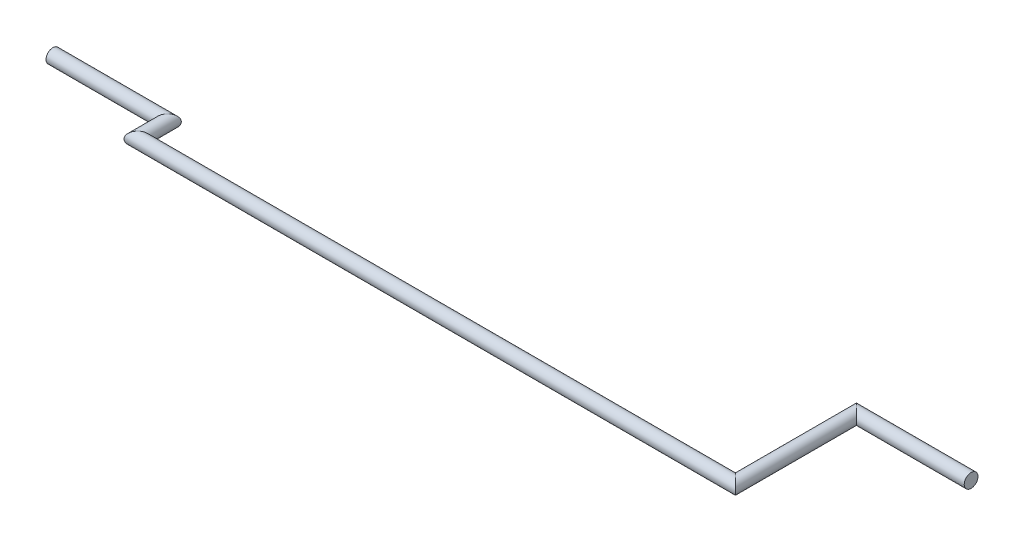
ISO-10303-21;
HEADER;
FILE_DESCRIPTION(('STEP AP214'),'2;1');
FILE_NAME('part.step','',(''),(''),'','','');
FILE_SCHEMA(('AUTOMOTIVE_DESIGN { 1 0 10303 214 1 1 1 1 }'));
ENDSEC;
DATA;
#1=APPLICATION_CONTEXT('core data for automotive mechanical design processes');
#2=APPLICATION_PROTOCOL_DEFINITION('international standard','automotive_design',2000,#1);
#3=PRODUCT_CONTEXT('',#1,'mechanical');
#4=PRODUCT('Part','Part','',(#3));
#5=PRODUCT_RELATED_PRODUCT_CATEGORY('part','',(#4));
#6=PRODUCT_DEFINITION_FORMATION('','',#4);
#7=PRODUCT_DEFINITION_CONTEXT('part definition',#1,'design');
#8=PRODUCT_DEFINITION('design','',#6,#7);
#9=PRODUCT_DEFINITION_SHAPE('','',#8);
#10=(LENGTH_UNIT() NAMED_UNIT(*) SI_UNIT(.MILLI.,.METRE.));
#11=(NAMED_UNIT(*) PLANE_ANGLE_UNIT() SI_UNIT($,.RADIAN.));
#12=(NAMED_UNIT(*) SI_UNIT($,.STERADIAN.) SOLID_ANGLE_UNIT());
#13=UNCERTAINTY_MEASURE_WITH_UNIT(LENGTH_MEASURE(1.E-05),#10,'distance_accuracy_value','');
#14=(GEOMETRIC_REPRESENTATION_CONTEXT(3) GLOBAL_UNCERTAINTY_ASSIGNED_CONTEXT((#13)) GLOBAL_UNIT_ASSIGNED_CONTEXT((#10,
#11,#12)) REPRESENTATION_CONTEXT('',''));
#15=CARTESIAN_POINT('',(0.,0.,0.));
#16=DIRECTION('',(0.,0.,1.));
#17=DIRECTION('',(1.,0.,0.));
#18=AXIS2_PLACEMENT_3D('',#15,#16,#17);
#19=CARTESIAN_POINT('',(-10.,0.,-2.6));
#20=DIRECTION('',(1.,0.,0.));
#21=DIRECTION('',(0.,0.,-1.));
#22=AXIS2_PLACEMENT_3D('',#19,#20,#21);
#23=PLANE('',#22);
#24=CARTESIAN_POINT('',(-10.,0.,-2.6));
#25=DIRECTION('',(1.,0.,0.));
#26=DIRECTION('',(0.,0.,-1.));
#27=AXIS2_PLACEMENT_3D('',#24,#25,#26);
#28=CIRCLE('',#27,0.6);
#29=CARTESIAN_POINT('',(-10.,0.,-3.2));
#30=VERTEX_POINT('',#29);
#31=EDGE_CURVE('E46',#30,#30,#28,.T.);
#32=ORIENTED_EDGE('',*,*,#31,.F.);
#33=EDGE_LOOP('',(#32));
#34=FACE_BOUND('',#33,.T.);
#35=ADVANCED_FACE('F43',(#34),#23,.F.);
#36=CARTESIAN_POINT('',(62.11,0.,-10.55));
#37=DIRECTION('',(1.,0.,0.));
#38=DIRECTION('',(0.,0.,-1.));
#39=AXIS2_PLACEMENT_3D('',#36,#37,#38);
#40=PLANE('',#39);
#41=CARTESIAN_POINT('',(62.11,0.,-10.55));
#42=DIRECTION('',(1.,0.,0.));
#43=DIRECTION('',(0.,0.,-1.));
#44=AXIS2_PLACEMENT_3D('',#41,#42,#43);
#45=CIRCLE('',#44,0.6);
#46=CARTESIAN_POINT('',(62.11,0.,-11.15));
#47=VERTEX_POINT('',#46);
#48=EDGE_CURVE('E49',#47,#47,#45,.T.);
#49=ORIENTED_EDGE('',*,*,#48,.T.);
#50=EDGE_LOOP('',(#49));
#51=FACE_BOUND('',#50,.T.);
#52=ADVANCED_FACE('F75',(#51),#40,.T.);
#53=CARTESIAN_POINT('',(0.76,0.,-2.6));
#54=DIRECTION('',(-1.,0.,0.));
#55=DIRECTION('',(0.,0.,1.));
#56=AXIS2_PLACEMENT_3D('',#53,#54,#55);
#57=CYLINDRICAL_SURFACE('',#56,0.6);
#58=CARTESIAN_POINT('',(0.,0.,-2.6));
#59=DIRECTION('',(-0.707106781186548,0.,-0.707106781186547));
#60=DIRECTION('',(0.707106781186547,0.,-0.707106781186548));
#61=AXIS2_PLACEMENT_3D('',#58,#59,#60);
#62=ELLIPSE('',#61,0.848528137423857,0.6);
#63=CARTESIAN_POINT('',(0.6,0.,-3.2));
#64=VERTEX_POINT('',#63);
#65=EDGE_CURVE('E64',#64,#64,#62,.T.);
#66=ORIENTED_EDGE('',*,*,#65,.T.);
#67=EDGE_LOOP('',(#66));
#68=FACE_BOUND('',#67,.T.);
#69=ORIENTED_EDGE('',*,*,#31,.T.);
#70=EDGE_LOOP('',(#69));
#71=FACE_BOUND('',#70,.T.);
#72=ADVANCED_FACE('F66',(#68,#71),#57,.T.);
#73=CARTESIAN_POINT('',(0.,0.,0.76));
#74=DIRECTION('',(0.,0.,-1.));
#75=DIRECTION('',(-1.,0.,0.));
#76=AXIS2_PLACEMENT_3D('',#73,#74,#75);
#77=CYLINDRICAL_SURFACE('',#76,0.6);
#78=CARTESIAN_POINT('',(0.,0.,0.));
#79=DIRECTION('',(-0.707106781186547,0.,-0.707106781186547));
#80=DIRECTION('',(-0.707106781186548,0.,0.707106781186548));
#81=AXIS2_PLACEMENT_3D('',#78,#79,#80);
#82=ELLIPSE('',#81,0.848528137423857,0.6);
#83=CARTESIAN_POINT('',(-0.599999999999993,0.,0.600000000000002));
#84=VERTEX_POINT('',#83);
#85=EDGE_CURVE('E58',#84,#84,#82,.T.);
#86=ORIENTED_EDGE('',*,*,#85,.T.);
#87=EDGE_LOOP('',(#86));
#88=FACE_BOUND('',#87,.T.);
#89=ORIENTED_EDGE('',*,*,#65,.F.);
#90=EDGE_LOOP('',(#89));
#91=FACE_BOUND('',#90,.T.);
#92=ADVANCED_FACE('F95',(#88,#91),#77,.T.);
#93=CARTESIAN_POINT('',(52.87,0.,0.));
#94=DIRECTION('',(-1.,0.,0.));
#95=DIRECTION('',(0.,0.,1.));
#96=AXIS2_PLACEMENT_3D('',#93,#94,#95);
#97=CYLINDRICAL_SURFACE('',#96,0.6);
#98=CARTESIAN_POINT('',(52.11,0.,0.));
#99=DIRECTION('',(-0.707106781186547,0.,0.707106781186547));
#100=DIRECTION('',(0.707106781186548,0.,0.707106781186548));
#101=AXIS2_PLACEMENT_3D('',#98,#99,#100);
#102=ELLIPSE('',#101,0.848528137423857,0.6);
#103=CARTESIAN_POINT('',(52.71,0.,0.6));
#104=VERTEX_POINT('',#103);
#105=EDGE_CURVE('E54',#104,#104,#102,.T.);
#106=ORIENTED_EDGE('',*,*,#105,.T.);
#107=EDGE_LOOP('',(#106));
#108=FACE_BOUND('',#107,.T.);
#109=ORIENTED_EDGE('',*,*,#85,.F.);
#110=EDGE_LOOP('',(#109));
#111=FACE_BOUND('',#110,.T.);
#112=ADVANCED_FACE('F83',(#108,#111),#97,.T.);
#113=CARTESIAN_POINT('',(52.11,0.,-11.31));
#114=DIRECTION('',(0.,0.,1.));
#115=DIRECTION('',(1.,0.,0.));
#116=AXIS2_PLACEMENT_3D('',#113,#114,#115);
#117=CYLINDRICAL_SURFACE('',#116,0.6);
#118=CARTESIAN_POINT('',(52.11,0.,-10.55));
#119=DIRECTION('',(-0.707106781186547,0.,0.707106781186547));
#120=DIRECTION('',(-0.707106781186548,0.,-0.707106781186548));
#121=AXIS2_PLACEMENT_3D('',#118,#119,#120);
#122=ELLIPSE('',#121,0.848528137423857,0.6);
#123=CARTESIAN_POINT('',(51.51,0.,-11.15));
#124=VERTEX_POINT('',#123);
#125=EDGE_CURVE('E11',#124,#124,#122,.T.);
#126=ORIENTED_EDGE('',*,*,#125,.T.);
#127=EDGE_LOOP('',(#126));
#128=FACE_BOUND('',#127,.T.);
#129=ORIENTED_EDGE('',*,*,#105,.F.);
#130=EDGE_LOOP('',(#129));
#131=FACE_BOUND('',#130,.T.);
#132=ADVANCED_FACE('F80',(#128,#131),#117,.T.);
#133=CARTESIAN_POINT('',(62.11,0.,-10.55));
#134=DIRECTION('',(-1.,0.,0.));
#135=DIRECTION('',(0.,0.,1.));
#136=AXIS2_PLACEMENT_3D('',#133,#134,#135);
#137=CYLINDRICAL_SURFACE('',#136,0.6);
#138=ORIENTED_EDGE('',*,*,#48,.F.);
#139=EDGE_LOOP('',(#138));
#140=FACE_BOUND('',#139,.T.);
#141=ORIENTED_EDGE('',*,*,#125,.F.);
#142=EDGE_LOOP('',(#141));
#143=FACE_BOUND('',#142,.T.);
#144=ADVANCED_FACE('F79',(#140,#143),#137,.T.);
#145=CLOSED_SHELL('',(#35,#52,#72,#92,#112,#132,#144));
#146=MANIFOLD_SOLID_BREP('B2',#145);
#147=ADVANCED_BREP_SHAPE_REPRESENTATION('',(#18,#146),#14);
#148=SHAPE_DEFINITION_REPRESENTATION(#9,#147);
ENDSEC;
END-ISO-10303-21;
